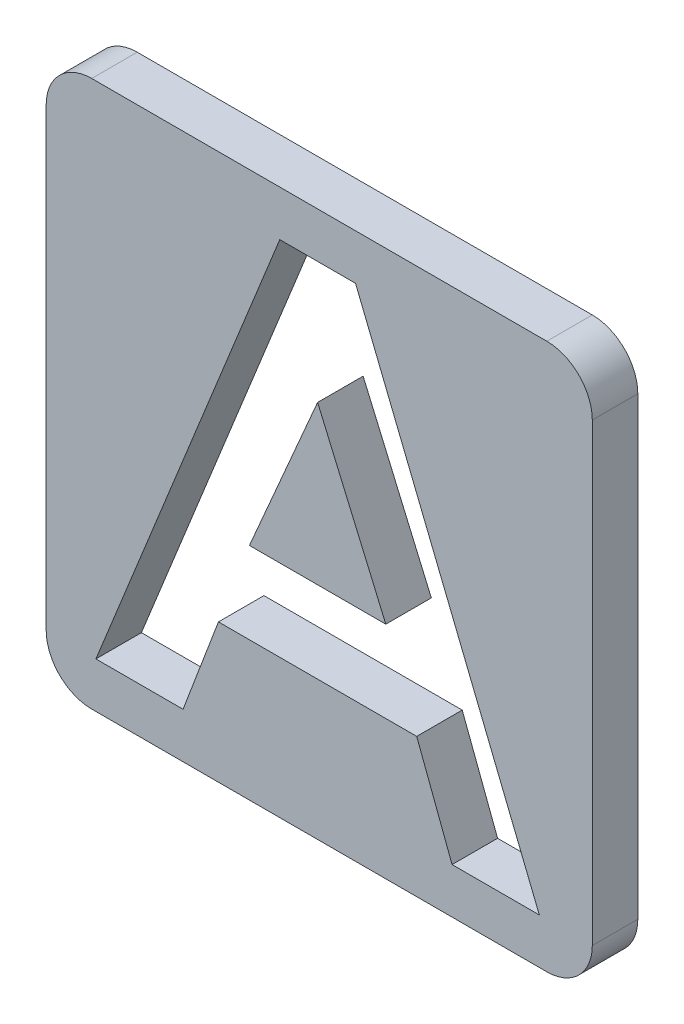
ISO-10303-21;
HEADER;
FILE_DESCRIPTION(('STEP AP214'),'2;1');
FILE_NAME('part.step','',(''),(''),'','','');
FILE_SCHEMA(('AUTOMOTIVE_DESIGN { 1 0 10303 214 1 1 1 1 }'));
ENDSEC;
DATA;
#1=APPLICATION_CONTEXT('core data for automotive mechanical design processes');
#2=APPLICATION_PROTOCOL_DEFINITION('international standard','automotive_design',2000,#1);
#3=PRODUCT_CONTEXT('',#1,'mechanical');
#4=PRODUCT('Part','Part','',(#3));
#5=PRODUCT_RELATED_PRODUCT_CATEGORY('part','',(#4));
#6=PRODUCT_DEFINITION_FORMATION('','',#4);
#7=PRODUCT_DEFINITION_CONTEXT('part definition',#1,'design');
#8=PRODUCT_DEFINITION('design','',#6,#7);
#9=PRODUCT_DEFINITION_SHAPE('','',#8);
#10=(LENGTH_UNIT() NAMED_UNIT(*) SI_UNIT(.MILLI.,.METRE.));
#11=(NAMED_UNIT(*) PLANE_ANGLE_UNIT() SI_UNIT($,.RADIAN.));
#12=(NAMED_UNIT(*) SI_UNIT($,.STERADIAN.) SOLID_ANGLE_UNIT());
#13=UNCERTAINTY_MEASURE_WITH_UNIT(LENGTH_MEASURE(1.E-05),#10,'distance_accuracy_value','');
#14=(GEOMETRIC_REPRESENTATION_CONTEXT(3) GLOBAL_UNCERTAINTY_ASSIGNED_CONTEXT((#13)) GLOBAL_UNIT_ASSIGNED_CONTEXT((#10,
#11,#12)) REPRESENTATION_CONTEXT('',''));
#15=CARTESIAN_POINT('',(0.,0.,0.));
#16=DIRECTION('',(0.,0.,1.));
#17=DIRECTION('',(1.,0.,0.));
#18=AXIS2_PLACEMENT_3D('',#15,#16,#17);
#19=CARTESIAN_POINT('',(50.,50.,10.));
#20=DIRECTION('',(0.,0.,-1.));
#21=DIRECTION('',(-1.,0.,0.));
#22=AXIS2_PLACEMENT_3D('',#19,#20,#21);
#23=PLANE('',#22);
#24=DIRECTION('',(1.,0.,0.));
#25=VECTOR('',#24,1.);
#26=CARTESIAN_POINT('',(-49.9999999999999,60.,10.));
#27=LINE('',#26,#25);
#28=CARTESIAN_POINT('',(-49.9999999999999,60.,10.));
#29=VERTEX_POINT('',#28);
#30=CARTESIAN_POINT('',(49.9999999999999,60.,10.));
#31=VERTEX_POINT('',#30);
#32=EDGE_CURVE('E209',#29,#31,#27,.T.);
#33=ORIENTED_EDGE('',*,*,#32,.F.);
#34=CARTESIAN_POINT('',(-50.,50.,10.));
#35=DIRECTION('',(0.,0.,1.));
#36=DIRECTION('',(1.,0.,0.));
#37=AXIS2_PLACEMENT_3D('',#34,#35,#36);
#38=CIRCLE('',#37,10.);
#39=CARTESIAN_POINT('',(-60.,49.9999999999999,10.));
#40=VERTEX_POINT('',#39);
#41=EDGE_CURVE('E318',#29,#40,#38,.T.);
#42=ORIENTED_EDGE('',*,*,#41,.T.);
#43=DIRECTION('',(0.,-1.,0.));
#44=VECTOR('',#43,1.);
#45=CARTESIAN_POINT('',(-60.,49.9999999999999,10.));
#46=LINE('',#45,#44);
#47=CARTESIAN_POINT('',(-60.,-49.9999999999999,10.));
#48=VERTEX_POINT('',#47);
#49=EDGE_CURVE('E320',#40,#48,#46,.T.);
#50=ORIENTED_EDGE('',*,*,#49,.T.);
#51=CARTESIAN_POINT('',(-50.,-50.,10.));
#52=DIRECTION('',(0.,0.,1.));
#53=DIRECTION('',(1.,0.,0.));
#54=AXIS2_PLACEMENT_3D('',#51,#52,#53);
#55=CIRCLE('',#54,10.);
#56=CARTESIAN_POINT('',(-49.9999999999999,-60.,10.));
#57=VERTEX_POINT('',#56);
#58=EDGE_CURVE('E322',#48,#57,#55,.T.);
#59=ORIENTED_EDGE('',*,*,#58,.T.);
#60=DIRECTION('',(1.,0.,0.));
#61=VECTOR('',#60,1.);
#62=CARTESIAN_POINT('',(-49.9999999999999,-60.,10.));
#63=LINE('',#62,#61);
#64=CARTESIAN_POINT('',(49.9999999999999,-60.,10.));
#65=VERTEX_POINT('',#64);
#66=EDGE_CURVE('E324',#57,#65,#63,.T.);
#67=ORIENTED_EDGE('',*,*,#66,.T.);
#68=CARTESIAN_POINT('',(50.,-50.,10.));
#69=DIRECTION('',(0.,0.,1.));
#70=DIRECTION('',(1.,0.,0.));
#71=AXIS2_PLACEMENT_3D('',#68,#69,#70);
#72=CIRCLE('',#71,10.);
#73=CARTESIAN_POINT('',(60.,-50.,10.));
#74=VERTEX_POINT('',#73);
#75=EDGE_CURVE('E190',#65,#74,#72,.T.);
#76=ORIENTED_EDGE('',*,*,#75,.T.);
#77=DIRECTION('',(0.,-1.,0.));
#78=VECTOR('',#77,1.);
#79=CARTESIAN_POINT('',(60.,49.9999999999999,10.));
#80=LINE('',#79,#78);
#81=CARTESIAN_POINT('',(60.,49.9999999999999,10.));
#82=VERTEX_POINT('',#81);
#83=EDGE_CURVE('E327',#82,#74,#80,.T.);
#84=ORIENTED_EDGE('',*,*,#83,.F.);
#85=CARTESIAN_POINT('',(50.,50.,10.));
#86=DIRECTION('',(0.,0.,-1.));
#87=DIRECTION('',(-1.,0.,0.));
#88=AXIS2_PLACEMENT_3D('',#85,#86,#87);
#89=CIRCLE('',#88,10.);
#90=EDGE_CURVE('E331',#31,#82,#89,.T.);
#91=ORIENTED_EDGE('',*,*,#90,.F.);
#92=EDGE_LOOP('',(#33,#42,#50,#59,#67,#76,#84,#91));
#93=FACE_BOUND('',#92,.T.);
#94=DIRECTION('',(0.374622732778073,0.927177333677808,0.));
#95=VECTOR('',#94,1.);
#96=CARTESIAN_POINT('',(-49.0769230769231,-50.,10.));
#97=LINE('',#96,#95);
#98=CARTESIAN_POINT('',(-49.0769230769231,-50.,10.));
#99=VERTEX_POINT('',#98);
#100=CARTESIAN_POINT('',(-8.67227564102564,50.,10.));
#101=VERTEX_POINT('',#100);
#102=EDGE_CURVE('E103',#99,#101,#97,.T.);
#103=ORIENTED_EDGE('',*,*,#102,.T.);
#104=DIRECTION('',(1.,0.,0.));
#105=VECTOR('',#104,1.);
#106=CARTESIAN_POINT('',(-8.67227564102564,50.,10.));
#107=LINE('',#106,#105);
#108=CARTESIAN_POINT('',(7.97435897435898,50.,10.));
#109=VERTEX_POINT('',#108);
#110=EDGE_CURVE('E93',#101,#109,#107,.T.);
#111=ORIENTED_EDGE('',*,*,#110,.T.);
#112=DIRECTION('',(0.374463049601283,-0.92724183710794,0.));
#113=VECTOR('',#112,1.);
#114=CARTESIAN_POINT('',(7.97435897435898,50.,10.));
#115=LINE('',#114,#113);
#116=CARTESIAN_POINT('',(48.3589743589744,-50.,10.));
#117=VERTEX_POINT('',#116);
#118=EDGE_CURVE('E168',#109,#117,#115,.T.);
#119=ORIENTED_EDGE('',*,*,#118,.T.);
#120=DIRECTION('',(-1.,0.,0.));
#121=VECTOR('',#120,1.);
#122=CARTESIAN_POINT('',(48.3589743589744,-50.,10.));
#123=LINE('',#122,#121);
#124=CARTESIAN_POINT('',(29.1883012820513,-50.,10.));
#125=VERTEX_POINT('',#124);
#126=EDGE_CURVE('E176',#117,#125,#123,.T.);
#127=ORIENTED_EDGE('',*,*,#126,.T.);
#128=DIRECTION('',(-0.354323863096985,0.935122772709568,0.));
#129=VECTOR('',#128,1.);
#130=CARTESIAN_POINT('',(29.1883012820513,-50.,10.));
#131=LINE('',#130,#129);
#132=CARTESIAN_POINT('',(21.4158653846154,-29.4871794871795,10.));
#133=VERTEX_POINT('',#132);
#134=EDGE_CURVE('E183',#125,#133,#131,.T.);
#135=ORIENTED_EDGE('',*,*,#134,.T.);
#136=DIRECTION('',(-1.,0.,0.));
#137=VECTOR('',#136,1.);
#138=CARTESIAN_POINT('',(21.4158653846154,-29.4871794871795,10.));
#139=LINE('',#138,#137);
#140=CARTESIAN_POINT('',(-22.1538461538461,-29.4871794871795,10.));
#141=VERTEX_POINT('',#140);
#142=EDGE_CURVE('E223',#133,#141,#139,.T.);
#143=ORIENTED_EDGE('',*,*,#142,.T.);
#144=DIRECTION('',(-0.354323863096985,-0.935122772709568,0.));
#145=VECTOR('',#144,1.);
#146=CARTESIAN_POINT('',(-22.1538461538461,-29.4871794871795,10.));
#147=LINE('',#146,#145);
#148=CARTESIAN_POINT('',(-29.926282051282,-50.,10.));
#149=VERTEX_POINT('',#148);
#150=EDGE_CURVE('E220',#141,#149,#147,.T.);
#151=ORIENTED_EDGE('',*,*,#150,.T.);
#152=DIRECTION('',(-1.,0.,0.));
#153=VECTOR('',#152,1.);
#154=CARTESIAN_POINT('',(-29.926282051282,-50.,10.));
#155=LINE('',#154,#153);
#156=EDGE_CURVE('E216',#149,#99,#155,.T.);
#157=ORIENTED_EDGE('',*,*,#156,.T.);
#158=EDGE_LOOP('',(#103,#111,#119,#127,#135,#143,#151,#157));
#159=FACE_BOUND('',#158,.T.);
#160=ADVANCED_FACE('F43',(#93,#159),#23,.F.);
#161=CARTESIAN_POINT('',(50.,50.,0.));
#162=DIRECTION('',(0.,0.,-1.));
#163=DIRECTION('',(-1.,0.,0.));
#164=AXIS2_PLACEMENT_3D('',#161,#162,#163);
#165=PLANE('',#164);
#166=DIRECTION('',(1.,0.,0.));
#167=VECTOR('',#166,1.);
#168=CARTESIAN_POINT('',(-49.9999999999999,60.,0.));
#169=LINE('',#168,#167);
#170=CARTESIAN_POINT('',(-49.9999999999999,60.,0.));
#171=VERTEX_POINT('',#170);
#172=CARTESIAN_POINT('',(49.9999999999999,60.,0.));
#173=VERTEX_POINT('',#172);
#174=EDGE_CURVE('E219',#171,#173,#169,.T.);
#175=ORIENTED_EDGE('',*,*,#174,.T.);
#176=CARTESIAN_POINT('',(50.,50.,0.));
#177=DIRECTION('',(0.,0.,-1.));
#178=DIRECTION('',(-1.,0.,0.));
#179=AXIS2_PLACEMENT_3D('',#176,#177,#178);
#180=CIRCLE('',#179,10.);
#181=CARTESIAN_POINT('',(60.,49.9999999999999,0.));
#182=VERTEX_POINT('',#181);
#183=EDGE_CURVE('E303',#173,#182,#180,.T.);
#184=ORIENTED_EDGE('',*,*,#183,.T.);
#185=DIRECTION('',(0.,-1.,0.));
#186=VECTOR('',#185,1.);
#187=CARTESIAN_POINT('',(60.,49.9999999999999,0.));
#188=LINE('',#187,#186);
#189=CARTESIAN_POINT('',(60.,-50.,0.));
#190=VERTEX_POINT('',#189);
#191=EDGE_CURVE('E309',#182,#190,#188,.T.);
#192=ORIENTED_EDGE('',*,*,#191,.T.);
#193=CARTESIAN_POINT('',(50.,-50.,0.));
#194=DIRECTION('',(0.,0.,1.));
#195=DIRECTION('',(1.,0.,0.));
#196=AXIS2_PLACEMENT_3D('',#193,#194,#195);
#197=CIRCLE('',#196,10.);
#198=CARTESIAN_POINT('',(49.9999999999999,-60.,0.));
#199=VERTEX_POINT('',#198);
#200=EDGE_CURVE('E340',#199,#190,#197,.T.);
#201=ORIENTED_EDGE('',*,*,#200,.F.);
#202=DIRECTION('',(1.,0.,0.));
#203=VECTOR('',#202,1.);
#204=CARTESIAN_POINT('',(-49.9999999999999,-60.,0.));
#205=LINE('',#204,#203);
#206=CARTESIAN_POINT('',(-49.9999999999999,-60.,0.));
#207=VERTEX_POINT('',#206);
#208=EDGE_CURVE('E344',#207,#199,#205,.T.);
#209=ORIENTED_EDGE('',*,*,#208,.F.);
#210=CARTESIAN_POINT('',(-50.,-50.,0.));
#211=DIRECTION('',(0.,0.,1.));
#212=DIRECTION('',(1.,0.,0.));
#213=AXIS2_PLACEMENT_3D('',#210,#211,#212);
#214=CIRCLE('',#213,10.);
#215=CARTESIAN_POINT('',(-60.,-49.9999999999999,0.));
#216=VERTEX_POINT('',#215);
#217=EDGE_CURVE('E348',#216,#207,#214,.T.);
#218=ORIENTED_EDGE('',*,*,#217,.F.);
#219=DIRECTION('',(0.,-1.,0.));
#220=VECTOR('',#219,1.);
#221=CARTESIAN_POINT('',(-60.,49.9999999999999,0.));
#222=LINE('',#221,#220);
#223=CARTESIAN_POINT('',(-60.,49.9999999999999,0.));
#224=VERTEX_POINT('',#223);
#225=EDGE_CURVE('E352',#224,#216,#222,.T.);
#226=ORIENTED_EDGE('',*,*,#225,.F.);
#227=CARTESIAN_POINT('',(-50.,50.,0.));
#228=DIRECTION('',(0.,0.,1.));
#229=DIRECTION('',(1.,0.,0.));
#230=AXIS2_PLACEMENT_3D('',#227,#228,#229);
#231=CIRCLE('',#230,10.);
#232=EDGE_CURVE('E314',#171,#224,#231,.T.);
#233=ORIENTED_EDGE('',*,*,#232,.F.);
#234=EDGE_LOOP('',(#175,#184,#192,#201,#209,#218,#226,#233));
#235=FACE_BOUND('',#234,.T.);
#236=DIRECTION('',(1.,0.,0.));
#237=VECTOR('',#236,1.);
#238=CARTESIAN_POINT('',(-8.67227564102564,50.,0.));
#239=LINE('',#238,#237);
#240=CARTESIAN_POINT('',(-8.67227564102564,50.,0.));
#241=VERTEX_POINT('',#240);
#242=CARTESIAN_POINT('',(7.97435897435898,50.,0.));
#243=VERTEX_POINT('',#242);
#244=EDGE_CURVE('E89',#241,#243,#239,.T.);
#245=ORIENTED_EDGE('',*,*,#244,.F.);
#246=DIRECTION('',(0.374622732778073,0.927177333677808,0.));
#247=VECTOR('',#246,1.);
#248=CARTESIAN_POINT('',(-49.0769230769231,-50.,0.));
#249=LINE('',#248,#247);
#250=CARTESIAN_POINT('',(-49.0769230769231,-50.,0.));
#251=VERTEX_POINT('',#250);
#252=EDGE_CURVE('E46',#251,#241,#249,.T.);
#253=ORIENTED_EDGE('',*,*,#252,.F.);
#254=DIRECTION('',(-1.,0.,0.));
#255=VECTOR('',#254,1.);
#256=CARTESIAN_POINT('',(-29.926282051282,-50.,0.));
#257=LINE('',#256,#255);
#258=CARTESIAN_POINT('',(-29.926282051282,-50.,0.));
#259=VERTEX_POINT('',#258);
#260=EDGE_CURVE('E52',#259,#251,#257,.T.);
#261=ORIENTED_EDGE('',*,*,#260,.F.);
#262=DIRECTION('',(-0.354323863096985,-0.935122772709568,0.));
#263=VECTOR('',#262,1.);
#264=CARTESIAN_POINT('',(-22.1538461538461,-29.4871794871795,0.));
#265=LINE('',#264,#263);
#266=CARTESIAN_POINT('',(-22.1538461538461,-29.4871794871795,0.));
#267=VERTEX_POINT('',#266);
#268=EDGE_CURVE('E193',#267,#259,#265,.T.);
#269=ORIENTED_EDGE('',*,*,#268,.F.);
#270=DIRECTION('',(-1.,0.,0.));
#271=VECTOR('',#270,1.);
#272=CARTESIAN_POINT('',(21.4158653846154,-29.4871794871795,0.));
#273=LINE('',#272,#271);
#274=CARTESIAN_POINT('',(21.4158653846154,-29.4871794871795,0.));
#275=VERTEX_POINT('',#274);
#276=EDGE_CURVE('E197',#275,#267,#273,.T.);
#277=ORIENTED_EDGE('',*,*,#276,.F.);
#278=DIRECTION('',(-0.354323863096985,0.935122772709568,0.));
#279=VECTOR('',#278,1.);
#280=CARTESIAN_POINT('',(29.1883012820513,-50.,0.));
#281=LINE('',#280,#279);
#282=CARTESIAN_POINT('',(29.1883012820513,-50.,0.));
#283=VERTEX_POINT('',#282);
#284=EDGE_CURVE('E200',#283,#275,#281,.T.);
#285=ORIENTED_EDGE('',*,*,#284,.F.);
#286=DIRECTION('',(-1.,0.,0.));
#287=VECTOR('',#286,1.);
#288=CARTESIAN_POINT('',(48.3589743589744,-50.,0.));
#289=LINE('',#288,#287);
#290=CARTESIAN_POINT('',(48.3589743589744,-50.,0.));
#291=VERTEX_POINT('',#290);
#292=EDGE_CURVE('E173',#291,#283,#289,.T.);
#293=ORIENTED_EDGE('',*,*,#292,.F.);
#294=DIRECTION('',(0.374463049601283,-0.92724183710794,0.));
#295=VECTOR('',#294,1.);
#296=CARTESIAN_POINT('',(7.97435897435898,50.,0.));
#297=LINE('',#296,#295);
#298=EDGE_CURVE('E170',#243,#291,#297,.T.);
#299=ORIENTED_EDGE('',*,*,#298,.F.);
#300=EDGE_LOOP('',(#245,#253,#261,#269,#277,#285,#293,#299));
#301=FACE_BOUND('',#300,.T.);
#302=ADVANCED_FACE('F242',(#235,#301),#165,.T.);
#303=CARTESIAN_POINT('',(-49.9999999999999,60.,10.));
#304=DIRECTION('',(0.,1.,0.));
#305=DIRECTION('',(0.,0.,1.));
#306=AXIS2_PLACEMENT_3D('',#303,#304,#305);
#307=PLANE('',#306);
#308=ORIENTED_EDGE('',*,*,#174,.F.);
#309=DIRECTION('',(0.,0.,-1.));
#310=VECTOR('',#309,1.);
#311=CARTESIAN_POINT('',(-49.9999999999999,60.,10.));
#312=LINE('',#311,#310);
#313=EDGE_CURVE('E353',#29,#171,#312,.T.);
#314=ORIENTED_EDGE('',*,*,#313,.F.);
#315=ORIENTED_EDGE('',*,*,#32,.T.);
#316=DIRECTION('',(0.,0.,-1.));
#317=VECTOR('',#316,1.);
#318=CARTESIAN_POINT('',(49.9999999999999,60.,10.));
#319=LINE('',#318,#317);
#320=EDGE_CURVE('E305',#31,#173,#319,.T.);
#321=ORIENTED_EDGE('',*,*,#320,.T.);
#322=EDGE_LOOP('',(#308,#314,#315,#321));
#323=FACE_BOUND('',#322,.T.);
#324=ADVANCED_FACE('F244',(#323),#307,.T.);
#325=CARTESIAN_POINT('',(-50.,50.,10.));
#326=DIRECTION('',(0.,0.,-1.));
#327=DIRECTION('',(-1.,0.,0.));
#328=AXIS2_PLACEMENT_3D('',#325,#326,#327);
#329=CYLINDRICAL_SURFACE('',#328,10.);
#330=ORIENTED_EDGE('',*,*,#232,.T.);
#331=DIRECTION('',(0.,0.,-1.));
#332=VECTOR('',#331,1.);
#333=CARTESIAN_POINT('',(-60.,49.9999999999999,10.));
#334=LINE('',#333,#332);
#335=EDGE_CURVE('E349',#40,#224,#334,.T.);
#336=ORIENTED_EDGE('',*,*,#335,.F.);
#337=ORIENTED_EDGE('',*,*,#41,.F.);
#338=ORIENTED_EDGE('',*,*,#313,.T.);
#339=EDGE_LOOP('',(#330,#336,#337,#338));
#340=FACE_BOUND('',#339,.T.);
#341=ADVANCED_FACE('F250',(#340),#329,.T.);
#342=CARTESIAN_POINT('',(-60.,49.9999999999999,10.));
#343=DIRECTION('',(1.,0.,0.));
#344=DIRECTION('',(0.,1.,0.));
#345=AXIS2_PLACEMENT_3D('',#342,#343,#344);
#346=PLANE('',#345);
#347=ORIENTED_EDGE('',*,*,#225,.T.);
#348=DIRECTION('',(0.,0.,-1.));
#349=VECTOR('',#348,1.);
#350=CARTESIAN_POINT('',(-60.,-49.9999999999999,10.));
#351=LINE('',#350,#349);
#352=EDGE_CURVE('E345',#48,#216,#351,.T.);
#353=ORIENTED_EDGE('',*,*,#352,.F.);
#354=ORIENTED_EDGE('',*,*,#49,.F.);
#355=ORIENTED_EDGE('',*,*,#335,.T.);
#356=EDGE_LOOP('',(#347,#353,#354,#355));
#357=FACE_BOUND('',#356,.T.);
#358=ADVANCED_FACE('F276',(#357),#346,.F.);
#359=CARTESIAN_POINT('',(-50.,-50.,10.));
#360=DIRECTION('',(0.,0.,-1.));
#361=DIRECTION('',(-1.,0.,0.));
#362=AXIS2_PLACEMENT_3D('',#359,#360,#361);
#363=CYLINDRICAL_SURFACE('',#362,10.);
#364=ORIENTED_EDGE('',*,*,#217,.T.);
#365=DIRECTION('',(0.,0.,-1.));
#366=VECTOR('',#365,1.);
#367=CARTESIAN_POINT('',(-49.9999999999999,-60.,10.));
#368=LINE('',#367,#366);
#369=EDGE_CURVE('E341',#57,#207,#368,.T.);
#370=ORIENTED_EDGE('',*,*,#369,.F.);
#371=ORIENTED_EDGE('',*,*,#58,.F.);
#372=ORIENTED_EDGE('',*,*,#352,.T.);
#373=EDGE_LOOP('',(#364,#370,#371,#372));
#374=FACE_BOUND('',#373,.T.);
#375=ADVANCED_FACE('F280',(#374),#363,.T.);
#376=CARTESIAN_POINT('',(-49.9999999999999,-60.,10.));
#377=DIRECTION('',(0.,1.,0.));
#378=DIRECTION('',(0.,0.,1.));
#379=AXIS2_PLACEMENT_3D('',#376,#377,#378);
#380=PLANE('',#379);
#381=ORIENTED_EDGE('',*,*,#208,.T.);
#382=DIRECTION('',(0.,0.,-1.));
#383=VECTOR('',#382,1.);
#384=CARTESIAN_POINT('',(49.9999999999999,-60.,10.));
#385=LINE('',#384,#383);
#386=EDGE_CURVE('E330',#65,#199,#385,.T.);
#387=ORIENTED_EDGE('',*,*,#386,.F.);
#388=ORIENTED_EDGE('',*,*,#66,.F.);
#389=ORIENTED_EDGE('',*,*,#369,.T.);
#390=EDGE_LOOP('',(#381,#387,#388,#389));
#391=FACE_BOUND('',#390,.T.);
#392=ADVANCED_FACE('F284',(#391),#380,.F.);
#393=CARTESIAN_POINT('',(50.,-50.,10.));
#394=DIRECTION('',(0.,0.,-1.));
#395=DIRECTION('',(-1.,0.,0.));
#396=AXIS2_PLACEMENT_3D('',#393,#394,#395);
#397=CYLINDRICAL_SURFACE('',#396,10.);
#398=ORIENTED_EDGE('',*,*,#200,.T.);
#399=DIRECTION('',(0.,0.,-1.));
#400=VECTOR('',#399,1.);
#401=CARTESIAN_POINT('',(60.,-50.,10.));
#402=LINE('',#401,#400);
#403=EDGE_CURVE('E329',#74,#190,#402,.T.);
#404=ORIENTED_EDGE('',*,*,#403,.F.);
#405=ORIENTED_EDGE('',*,*,#75,.F.);
#406=ORIENTED_EDGE('',*,*,#386,.T.);
#407=EDGE_LOOP('',(#398,#404,#405,#406));
#408=FACE_BOUND('',#407,.T.);
#409=ADVANCED_FACE('F288',(#408),#397,.T.);
#410=CARTESIAN_POINT('',(60.,49.9999999999999,10.));
#411=DIRECTION('',(1.,0.,0.));
#412=DIRECTION('',(0.,1.,0.));
#413=AXIS2_PLACEMENT_3D('',#410,#411,#412);
#414=PLANE('',#413);
#415=ORIENTED_EDGE('',*,*,#191,.F.);
#416=DIRECTION('',(0.,0.,-1.));
#417=VECTOR('',#416,1.);
#418=CARTESIAN_POINT('',(60.,49.9999999999999,10.));
#419=LINE('',#418,#417);
#420=EDGE_CURVE('E207',#82,#182,#419,.T.);
#421=ORIENTED_EDGE('',*,*,#420,.F.);
#422=ORIENTED_EDGE('',*,*,#83,.T.);
#423=ORIENTED_EDGE('',*,*,#403,.T.);
#424=EDGE_LOOP('',(#415,#421,#422,#423));
#425=FACE_BOUND('',#424,.T.);
#426=ADVANCED_FACE('F292',(#425),#414,.T.);
#427=CARTESIAN_POINT('',(50.,50.,10.));
#428=DIRECTION('',(0.,0.,-1.));
#429=DIRECTION('',(-1.,0.,0.));
#430=AXIS2_PLACEMENT_3D('',#427,#428,#429);
#431=CYLINDRICAL_SURFACE('',#430,10.);
#432=ORIENTED_EDGE('',*,*,#183,.F.);
#433=ORIENTED_EDGE('',*,*,#320,.F.);
#434=ORIENTED_EDGE('',*,*,#90,.T.);
#435=ORIENTED_EDGE('',*,*,#420,.T.);
#436=EDGE_LOOP('',(#432,#433,#434,#435));
#437=FACE_BOUND('',#436,.T.);
#438=ADVANCED_FACE('F273',(#437),#431,.T.);
#439=CARTESIAN_POINT('',(-49.0769230769231,-50.,0.));
#440=DIRECTION('',(0.927177333677808,-0.374622732778073,0.));
#441=DIRECTION('',(0.374622732778073,0.927177333677808,0.));
#442=AXIS2_PLACEMENT_3D('',#439,#440,#441);
#443=PLANE('',#442);
#444=ORIENTED_EDGE('',*,*,#102,.F.);
#445=DIRECTION('',(0.,0.,1.));
#446=VECTOR('',#445,1.);
#447=CARTESIAN_POINT('',(-49.0769230769231,-50.,0.));
#448=LINE('',#447,#446);
#449=EDGE_CURVE('E12',#251,#99,#448,.T.);
#450=ORIENTED_EDGE('',*,*,#449,.F.);
#451=ORIENTED_EDGE('',*,*,#252,.T.);
#452=DIRECTION('',(0.,0.,1.));
#453=VECTOR('',#452,1.);
#454=CARTESIAN_POINT('',(-8.67227564102564,50.,0.));
#455=LINE('',#454,#453);
#456=EDGE_CURVE('E204',#241,#101,#455,.T.);
#457=ORIENTED_EDGE('',*,*,#456,.T.);
#458=EDGE_LOOP('',(#444,#450,#451,#457));
#459=FACE_BOUND('',#458,.T.);
#460=ADVANCED_FACE('F240',(#459),#443,.T.);
#461=CARTESIAN_POINT('',(-8.67227564102564,50.,0.));
#462=DIRECTION('',(0.,-1.,0.));
#463=DIRECTION('',(0.,0.,-1.));
#464=AXIS2_PLACEMENT_3D('',#461,#462,#463);
#465=PLANE('',#464);
#466=ORIENTED_EDGE('',*,*,#110,.F.);
#467=ORIENTED_EDGE('',*,*,#456,.F.);
#468=ORIENTED_EDGE('',*,*,#244,.T.);
#469=DIRECTION('',(0.,0.,1.));
#470=VECTOR('',#469,1.);
#471=CARTESIAN_POINT('',(7.97435897435898,50.,0.));
#472=LINE('',#471,#470);
#473=EDGE_CURVE('E203',#243,#109,#472,.T.);
#474=ORIENTED_EDGE('',*,*,#473,.T.);
#475=EDGE_LOOP('',(#466,#467,#468,#474));
#476=FACE_BOUND('',#475,.T.);
#477=ADVANCED_FACE('F268',(#476),#465,.T.);
#478=CARTESIAN_POINT('',(7.97435897435898,50.,0.));
#479=DIRECTION('',(-0.92724183710794,-0.374463049601283,0.));
#480=DIRECTION('',(0.374463049601283,-0.92724183710794,0.));
#481=AXIS2_PLACEMENT_3D('',#478,#479,#480);
#482=PLANE('',#481);
#483=ORIENTED_EDGE('',*,*,#118,.F.);
#484=ORIENTED_EDGE('',*,*,#473,.F.);
#485=ORIENTED_EDGE('',*,*,#298,.T.);
#486=DIRECTION('',(0.,0.,1.));
#487=VECTOR('',#486,1.);
#488=CARTESIAN_POINT('',(48.3589743589744,-50.,0.));
#489=LINE('',#488,#487);
#490=EDGE_CURVE('E164',#291,#117,#489,.T.);
#491=ORIENTED_EDGE('',*,*,#490,.T.);
#492=EDGE_LOOP('',(#483,#484,#485,#491));
#493=FACE_BOUND('',#492,.T.);
#494=ADVANCED_FACE('F166',(#493),#482,.T.);
#495=CARTESIAN_POINT('',(48.3589743589744,-50.,0.));
#496=DIRECTION('',(0.,1.,0.));
#497=DIRECTION('',(0.,0.,1.));
#498=AXIS2_PLACEMENT_3D('',#495,#496,#497);
#499=PLANE('',#498);
#500=ORIENTED_EDGE('',*,*,#126,.F.);
#501=ORIENTED_EDGE('',*,*,#490,.F.);
#502=ORIENTED_EDGE('',*,*,#292,.T.);
#503=DIRECTION('',(0.,0.,1.));
#504=VECTOR('',#503,1.);
#505=CARTESIAN_POINT('',(29.1883012820513,-50.,0.));
#506=LINE('',#505,#504);
#507=EDGE_CURVE('E179',#283,#125,#506,.T.);
#508=ORIENTED_EDGE('',*,*,#507,.T.);
#509=EDGE_LOOP('',(#500,#501,#502,#508));
#510=FACE_BOUND('',#509,.T.);
#511=ADVANCED_FACE('F177',(#510),#499,.T.);
#512=CARTESIAN_POINT('',(29.1883012820513,-50.,0.));
#513=DIRECTION('',(0.935122772709568,0.354323863096985,0.));
#514=DIRECTION('',(-0.354323863096985,0.935122772709568,0.));
#515=AXIS2_PLACEMENT_3D('',#512,#513,#514);
#516=PLANE('',#515);
#517=ORIENTED_EDGE('',*,*,#134,.F.);
#518=ORIENTED_EDGE('',*,*,#507,.F.);
#519=ORIENTED_EDGE('',*,*,#284,.T.);
#520=DIRECTION('',(0.,0.,1.));
#521=VECTOR('',#520,1.);
#522=CARTESIAN_POINT('',(21.4158653846154,-29.4871794871795,0.));
#523=LINE('',#522,#521);
#524=EDGE_CURVE('E199',#275,#133,#523,.T.);
#525=ORIENTED_EDGE('',*,*,#524,.T.);
#526=EDGE_LOOP('',(#517,#518,#519,#525));
#527=FACE_BOUND('',#526,.T.);
#528=ADVANCED_FACE('F227',(#527),#516,.T.);
#529=CARTESIAN_POINT('',(21.4158653846154,-29.4871794871795,0.));
#530=DIRECTION('',(0.,1.,0.));
#531=DIRECTION('',(0.,0.,1.));
#532=AXIS2_PLACEMENT_3D('',#529,#530,#531);
#533=PLANE('',#532);
#534=ORIENTED_EDGE('',*,*,#142,.F.);
#535=ORIENTED_EDGE('',*,*,#524,.F.);
#536=ORIENTED_EDGE('',*,*,#276,.T.);
#537=DIRECTION('',(0.,0.,1.));
#538=VECTOR('',#537,1.);
#539=CARTESIAN_POINT('',(-22.1538461538461,-29.4871794871795,0.));
#540=LINE('',#539,#538);
#541=EDGE_CURVE('E196',#267,#141,#540,.T.);
#542=ORIENTED_EDGE('',*,*,#541,.T.);
#543=EDGE_LOOP('',(#534,#535,#536,#542));
#544=FACE_BOUND('',#543,.T.);
#545=ADVANCED_FACE('F232',(#544),#533,.T.);
#546=CARTESIAN_POINT('',(-22.1538461538461,-29.4871794871795,0.));
#547=DIRECTION('',(-0.935122772709568,0.354323863096985,0.));
#548=DIRECTION('',(-0.354323863096985,-0.935122772709568,0.));
#549=AXIS2_PLACEMENT_3D('',#546,#547,#548);
#550=PLANE('',#549);
#551=ORIENTED_EDGE('',*,*,#150,.F.);
#552=ORIENTED_EDGE('',*,*,#541,.F.);
#553=ORIENTED_EDGE('',*,*,#268,.T.);
#554=DIRECTION('',(0.,0.,1.));
#555=VECTOR('',#554,1.);
#556=CARTESIAN_POINT('',(-29.926282051282,-50.,0.));
#557=LINE('',#556,#555);
#558=EDGE_CURVE('E192',#259,#149,#557,.T.);
#559=ORIENTED_EDGE('',*,*,#558,.T.);
#560=EDGE_LOOP('',(#551,#552,#553,#559));
#561=FACE_BOUND('',#560,.T.);
#562=ADVANCED_FACE('F237',(#561),#550,.T.);
#563=CARTESIAN_POINT('',(-29.926282051282,-50.,0.));
#564=DIRECTION('',(0.,1.,0.));
#565=DIRECTION('',(0.,0.,1.));
#566=AXIS2_PLACEMENT_3D('',#563,#564,#565);
#567=PLANE('',#566);
#568=ORIENTED_EDGE('',*,*,#156,.F.);
#569=ORIENTED_EDGE('',*,*,#558,.F.);
#570=ORIENTED_EDGE('',*,*,#260,.T.);
#571=ORIENTED_EDGE('',*,*,#449,.T.);
#572=EDGE_LOOP('',(#568,#569,#570,#571));
#573=FACE_BOUND('',#572,.T.);
#574=ADVANCED_FACE('F239',(#573),#567,.T.);
#575=CLOSED_SHELL('',(#160,#302,#324,#341,#358,#375,#392,#409,#426,#438,#460,#477,#494,#511,
#528,#545,#562,#574));
#576=MANIFOLD_SOLID_BREP('B2',#575);
#577=CARTESIAN_POINT('',(50.,50.,0.));
#578=DIRECTION('',(0.,0.,-1.));
#579=DIRECTION('',(-1.,0.,0.));
#580=AXIS2_PLACEMENT_3D('',#577,#578,#579);
#581=PLANE('',#580);
#582=DIRECTION('',(-0.396283785267297,-0.91812807469014,0.));
#583=VECTOR('',#582,1.);
#584=CARTESIAN_POINT('',(-0.358974358974355,23.1770833333333,0.));
#585=LINE('',#584,#583);
#586=CARTESIAN_POINT('',(-0.358974358974352,23.1770833333333,0.));
#587=VERTEX_POINT('',#586);
#588=CARTESIAN_POINT('',(-15.3429487179487,-11.5384615384615,0.));
#589=VERTEX_POINT('',#588);
#590=EDGE_CURVE('E524',#587,#589,#585,.T.);
#591=ORIENTED_EDGE('',*,*,#590,.F.);
#592=DIRECTION('',(-0.396283785267297,0.91812807469014,0.));
#593=VECTOR('',#592,1.);
#594=CARTESIAN_POINT('',(14.625,-11.5384615384615,0.));
#595=LINE('',#594,#593);
#596=CARTESIAN_POINT('',(14.625,-11.5384615384615,0.));
#597=VERTEX_POINT('',#596);
#598=EDGE_CURVE('E504',#597,#587,#595,.T.);
#599=ORIENTED_EDGE('',*,*,#598,.F.);
#600=DIRECTION('',(1.,0.,0.));
#601=VECTOR('',#600,1.);
#602=CARTESIAN_POINT('',(-15.3429487179487,-11.5384615384615,0.));
#603=LINE('',#602,#601);
#604=EDGE_CURVE('E519',#589,#597,#603,.T.);
#605=ORIENTED_EDGE('',*,*,#604,.F.);
#606=EDGE_LOOP('',(#591,#599,#605));
#607=FACE_BOUND('',#606,.T.);
#608=ADVANCED_FACE('F481',(#607),#581,.T.);
#609=CARTESIAN_POINT('',(-0.358974358974355,23.1770833333333,0.));
#610=DIRECTION('',(-0.91812807469014,0.396283785267297,0.));
#611=DIRECTION('',(-0.396283785267297,-0.91812807469014,0.));
#612=AXIS2_PLACEMENT_3D('',#609,#610,#611);
#613=PLANE('',#612);
#614=DIRECTION('',(-0.396283785267297,-0.91812807469014,0.));
#615=VECTOR('',#614,1.);
#616=CARTESIAN_POINT('',(-0.358974358974355,23.1770833333333,10.));
#617=LINE('',#616,#615);
#618=CARTESIAN_POINT('',(-0.358974358974353,23.1770833333333,10.));
#619=VERTEX_POINT('',#618);
#620=CARTESIAN_POINT('',(-15.3429487179487,-11.5384615384615,10.));
#621=VERTEX_POINT('',#620);
#622=EDGE_CURVE('E528',#619,#621,#617,.T.);
#623=ORIENTED_EDGE('',*,*,#622,.F.);
#624=DIRECTION('',(0.,0.,1.));
#625=VECTOR('',#624,1.);
#626=CARTESIAN_POINT('',(-0.358974358974355,23.1770833333333,0.));
#627=LINE('',#626,#625);
#628=EDGE_CURVE('E484',#587,#619,#627,.T.);
#629=ORIENTED_EDGE('',*,*,#628,.F.);
#630=ORIENTED_EDGE('',*,*,#590,.T.);
#631=DIRECTION('',(0.,0.,1.));
#632=VECTOR('',#631,1.);
#633=CARTESIAN_POINT('',(-15.3429487179487,-11.5384615384615,0.));
#634=LINE('',#633,#632);
#635=EDGE_CURVE('E489',#589,#621,#634,.T.);
#636=ORIENTED_EDGE('',*,*,#635,.T.);
#637=EDGE_LOOP('',(#623,#629,#630,#636));
#638=FACE_BOUND('',#637,.T.);
#639=ADVANCED_FACE('F535',(#638),#613,.T.);
#640=CARTESIAN_POINT('',(-15.3429487179487,-11.5384615384615,0.));
#641=DIRECTION('',(0.,-1.,0.));
#642=DIRECTION('',(0.,0.,-1.));
#643=AXIS2_PLACEMENT_3D('',#640,#641,#642);
#644=PLANE('',#643);
#645=DIRECTION('',(1.,0.,0.));
#646=VECTOR('',#645,1.);
#647=CARTESIAN_POINT('',(-15.3429487179487,-11.5384615384615,10.));
#648=LINE('',#647,#646);
#649=CARTESIAN_POINT('',(14.625,-11.5384615384615,10.));
#650=VERTEX_POINT('',#649);
#651=EDGE_CURVE('E496',#621,#650,#648,.T.);
#652=ORIENTED_EDGE('',*,*,#651,.F.);
#653=ORIENTED_EDGE('',*,*,#635,.F.);
#654=ORIENTED_EDGE('',*,*,#604,.T.);
#655=DIRECTION('',(0.,0.,1.));
#656=VECTOR('',#655,1.);
#657=CARTESIAN_POINT('',(14.625,-11.5384615384615,0.));
#658=LINE('',#657,#656);
#659=EDGE_CURVE('E41',#597,#650,#658,.T.);
#660=ORIENTED_EDGE('',*,*,#659,.T.);
#661=EDGE_LOOP('',(#652,#653,#654,#660));
#662=FACE_BOUND('',#661,.T.);
#663=ADVANCED_FACE('F520',(#662),#644,.T.);
#664=CARTESIAN_POINT('',(14.625,-11.5384615384615,0.));
#665=DIRECTION('',(0.91812807469014,0.396283785267297,0.));
#666=DIRECTION('',(-0.396283785267297,0.91812807469014,0.));
#667=AXIS2_PLACEMENT_3D('',#664,#665,#666);
#668=PLANE('',#667);
#669=DIRECTION('',(-0.396283785267297,0.91812807469014,0.));
#670=VECTOR('',#669,1.);
#671=CARTESIAN_POINT('',(14.625,-11.5384615384615,10.));
#672=LINE('',#671,#670);
#673=EDGE_CURVE('E517',#650,#619,#672,.T.);
#674=ORIENTED_EDGE('',*,*,#673,.F.);
#675=ORIENTED_EDGE('',*,*,#659,.F.);
#676=ORIENTED_EDGE('',*,*,#598,.T.);
#677=ORIENTED_EDGE('',*,*,#628,.T.);
#678=EDGE_LOOP('',(#674,#675,#676,#677));
#679=FACE_BOUND('',#678,.T.);
#680=ADVANCED_FACE('F515',(#679),#668,.T.);
#681=CARTESIAN_POINT('',(50.,50.,10.));
#682=DIRECTION('',(0.,0.,-1.));
#683=DIRECTION('',(-1.,0.,0.));
#684=AXIS2_PLACEMENT_3D('',#681,#682,#683);
#685=PLANE('',#684);
#686=ORIENTED_EDGE('',*,*,#673,.T.);
#687=ORIENTED_EDGE('',*,*,#622,.T.);
#688=ORIENTED_EDGE('',*,*,#651,.T.);
#689=EDGE_LOOP('',(#686,#687,#688));
#690=FACE_BOUND('',#689,.T.);
#691=ADVANCED_FACE('F537',(#690),#685,.F.);
#692=CLOSED_SHELL('',(#608,#639,#663,#680,#691));
#693=MANIFOLD_SOLID_BREP('B6',#692);
#694=ADVANCED_BREP_SHAPE_REPRESENTATION('',(#18,#576,#693),#14);
#695=SHAPE_DEFINITION_REPRESENTATION(#9,#694);
ENDSEC;
END-ISO-10303-21;
